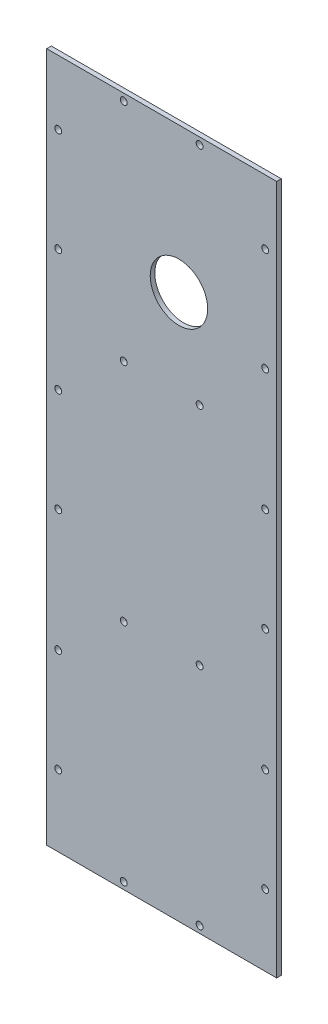
ISO-10303-21;
HEADER;
FILE_DESCRIPTION(('STEP AP214'),'2;1');
FILE_NAME('part.step','',(''),(''),'','','');
FILE_SCHEMA(('AUTOMOTIVE_DESIGN { 1 0 10303 214 1 1 1 1 }'));
ENDSEC;
DATA;
#1=APPLICATION_CONTEXT('core data for automotive mechanical design processes');
#2=APPLICATION_PROTOCOL_DEFINITION('international standard','automotive_design',2000,#1);
#3=PRODUCT_CONTEXT('',#1,'mechanical');
#4=PRODUCT('Part','Part','',(#3));
#5=PRODUCT_RELATED_PRODUCT_CATEGORY('part','',(#4));
#6=PRODUCT_DEFINITION_FORMATION('','',#4);
#7=PRODUCT_DEFINITION_CONTEXT('part definition',#1,'design');
#8=PRODUCT_DEFINITION('design','',#6,#7);
#9=PRODUCT_DEFINITION_SHAPE('','',#8);
#10=(LENGTH_UNIT() NAMED_UNIT(*) SI_UNIT(.MILLI.,.METRE.));
#11=(NAMED_UNIT(*) PLANE_ANGLE_UNIT() SI_UNIT($,.RADIAN.));
#12=(NAMED_UNIT(*) SI_UNIT($,.STERADIAN.) SOLID_ANGLE_UNIT());
#13=UNCERTAINTY_MEASURE_WITH_UNIT(LENGTH_MEASURE(1.E-05),#10,'distance_accuracy_value','');
#14=(GEOMETRIC_REPRESENTATION_CONTEXT(3) GLOBAL_UNCERTAINTY_ASSIGNED_CONTEXT((#13)) GLOBAL_UNIT_ASSIGNED_CONTEXT((#10,
#11,#12)) REPRESENTATION_CONTEXT('',''));
#15=CARTESIAN_POINT('',(0.,0.,0.));
#16=DIRECTION('',(0.,0.,1.));
#17=DIRECTION('',(1.,0.,0.));
#18=AXIS2_PLACEMENT_3D('',#15,#16,#17);
#19=CARTESIAN_POINT('',(-50.,-150.,2.));
#20=DIRECTION('',(1.,0.,0.));
#21=DIRECTION('',(0.,0.,-1.));
#22=AXIS2_PLACEMENT_3D('',#19,#20,#21);
#23=PLANE('',#22);
#24=DIRECTION('',(0.,-1.,0.));
#25=VECTOR('',#24,1.);
#26=CARTESIAN_POINT('',(-50.,-150.,0.));
#27=LINE('',#26,#25);
#28=CARTESIAN_POINT('',(-50.,150.,0.));
#29=VERTEX_POINT('',#28);
#30=CARTESIAN_POINT('',(-50.,-150.,0.));
#31=VERTEX_POINT('',#30);
#32=EDGE_CURVE('E109',#29,#31,#27,.T.);
#33=ORIENTED_EDGE('',*,*,#32,.T.);
#34=DIRECTION('',(0.,0.,-1.));
#35=VECTOR('',#34,1.);
#36=CARTESIAN_POINT('',(-50.,-150.,2.));
#37=LINE('',#36,#35);
#38=CARTESIAN_POINT('',(-50.,-150.,2.));
#39=VERTEX_POINT('',#38);
#40=EDGE_CURVE('E11',#39,#31,#37,.T.);
#41=ORIENTED_EDGE('',*,*,#40,.F.);
#42=DIRECTION('',(0.,-1.,0.));
#43=VECTOR('',#42,1.);
#44=CARTESIAN_POINT('',(-50.,-150.,2.));
#45=LINE('',#44,#43);
#46=CARTESIAN_POINT('',(-50.,150.,2.));
#47=VERTEX_POINT('',#46);
#48=EDGE_CURVE('E92',#47,#39,#45,.T.);
#49=ORIENTED_EDGE('',*,*,#48,.F.);
#50=DIRECTION('',(0.,0.,-1.));
#51=VECTOR('',#50,1.);
#52=CARTESIAN_POINT('',(-50.,150.,2.));
#53=LINE('',#52,#51);
#54=EDGE_CURVE('E105',#47,#29,#53,.T.);
#55=ORIENTED_EDGE('',*,*,#54,.T.);
#56=EDGE_LOOP('',(#33,#41,#49,#55));
#57=FACE_BOUND('',#56,.T.);
#58=ADVANCED_FACE('F38',(#57),#23,.F.);
#59=CARTESIAN_POINT('',(50.,-150.,2.));
#60=DIRECTION('',(0.,1.,0.));
#61=DIRECTION('',(0.,0.,1.));
#62=AXIS2_PLACEMENT_3D('',#59,#60,#61);
#63=PLANE('',#62);
#64=DIRECTION('',(1.,0.,0.));
#65=VECTOR('',#64,1.);
#66=CARTESIAN_POINT('',(50.,-150.,0.));
#67=LINE('',#66,#65);
#68=CARTESIAN_POINT('',(50.,-150.,0.));
#69=VERTEX_POINT('',#68);
#70=EDGE_CURVE('E97',#31,#69,#67,.T.);
#71=ORIENTED_EDGE('',*,*,#70,.T.);
#72=DIRECTION('',(0.,0.,-1.));
#73=VECTOR('',#72,1.);
#74=CARTESIAN_POINT('',(50.,-150.,2.));
#75=LINE('',#74,#73);
#76=CARTESIAN_POINT('',(50.,-150.,2.));
#77=VERTEX_POINT('',#76);
#78=EDGE_CURVE('E48',#77,#69,#75,.T.);
#79=ORIENTED_EDGE('',*,*,#78,.F.);
#80=DIRECTION('',(1.,0.,0.));
#81=VECTOR('',#80,1.);
#82=CARTESIAN_POINT('',(50.,-150.,2.));
#83=LINE('',#82,#81);
#84=EDGE_CURVE('E87',#39,#77,#83,.T.);
#85=ORIENTED_EDGE('',*,*,#84,.F.);
#86=ORIENTED_EDGE('',*,*,#40,.T.);
#87=EDGE_LOOP('',(#71,#79,#85,#86));
#88=FACE_BOUND('',#87,.T.);
#89=ADVANCED_FACE('F96',(#88),#63,.F.);
#90=CARTESIAN_POINT('',(50.,-150.,2.));
#91=DIRECTION('',(-1.,0.,0.));
#92=DIRECTION('',(0.,0.,1.));
#93=AXIS2_PLACEMENT_3D('',#90,#91,#92);
#94=PLANE('',#93);
#95=DIRECTION('',(0.,1.,0.));
#96=VECTOR('',#95,1.);
#97=CARTESIAN_POINT('',(50.,-150.,0.));
#98=LINE('',#97,#96);
#99=CARTESIAN_POINT('',(50.,150.,0.));
#100=VERTEX_POINT('',#99);
#101=EDGE_CURVE('E74',#69,#100,#98,.T.);
#102=ORIENTED_EDGE('',*,*,#101,.T.);
#103=DIRECTION('',(0.,0.,-1.));
#104=VECTOR('',#103,1.);
#105=CARTESIAN_POINT('',(50.,150.,2.));
#106=LINE('',#105,#104);
#107=CARTESIAN_POINT('',(50.,150.,2.));
#108=VERTEX_POINT('',#107);
#109=EDGE_CURVE('E99',#108,#100,#106,.T.);
#110=ORIENTED_EDGE('',*,*,#109,.F.);
#111=DIRECTION('',(0.,1.,0.));
#112=VECTOR('',#111,1.);
#113=CARTESIAN_POINT('',(50.,-150.,2.));
#114=LINE('',#113,#112);
#115=EDGE_CURVE('E90',#77,#108,#114,.T.);
#116=ORIENTED_EDGE('',*,*,#115,.F.);
#117=ORIENTED_EDGE('',*,*,#78,.T.);
#118=EDGE_LOOP('',(#102,#110,#116,#117));
#119=FACE_BOUND('',#118,.T.);
#120=ADVANCED_FACE('F101',(#119),#94,.F.);
#121=CARTESIAN_POINT('',(50.,150.,2.));
#122=DIRECTION('',(0.,-1.,0.));
#123=DIRECTION('',(1.,0.,0.));
#124=AXIS2_PLACEMENT_3D('',#121,#122,#123);
#125=PLANE('',#124);
#126=DIRECTION('',(-1.,0.,0.));
#127=VECTOR('',#126,1.);
#128=CARTESIAN_POINT('',(50.,150.,0.));
#129=LINE('',#128,#127);
#130=EDGE_CURVE('E80',#100,#29,#129,.T.);
#131=ORIENTED_EDGE('',*,*,#130,.T.);
#132=ORIENTED_EDGE('',*,*,#54,.F.);
#133=DIRECTION('',(-1.,0.,0.));
#134=VECTOR('',#133,1.);
#135=CARTESIAN_POINT('',(50.,150.,2.));
#136=LINE('',#135,#134);
#137=EDGE_CURVE('E57',#108,#47,#136,.T.);
#138=ORIENTED_EDGE('',*,*,#137,.F.);
#139=ORIENTED_EDGE('',*,*,#109,.T.);
#140=EDGE_LOOP('',(#131,#132,#138,#139));
#141=FACE_BOUND('',#140,.T.);
#142=ADVANCED_FACE('F241',(#141),#125,.F.);
#143=CARTESIAN_POINT('',(0.,0.,2.));
#144=DIRECTION('',(0.,0.,1.));
#145=DIRECTION('',(1.,0.,0.));
#146=AXIS2_PLACEMENT_3D('',#143,#144,#145);
#147=PLANE('',#146);
#148=CARTESIAN_POINT('',(7.50000000000001,87.,2.));
#149=DIRECTION('',(0.,0.,1.));
#150=DIRECTION('',(1.,0.,0.));
#151=AXIS2_PLACEMENT_3D('',#148,#149,#150);
#152=CIRCLE('',#151,12.5);
#153=CARTESIAN_POINT('',(20.,87.,2.));
#154=VERTEX_POINT('',#153);
#155=EDGE_CURVE('E568',#154,#154,#152,.T.);
#156=ORIENTED_EDGE('',*,*,#155,.F.);
#157=EDGE_LOOP('',(#156));
#158=FACE_BOUND('',#157,.T.);
#159=CARTESIAN_POINT('',(16.5,-147.,2.));
#160=DIRECTION('',(0.,0.,1.));
#161=DIRECTION('',(1.,0.,0.));
#162=AXIS2_PLACEMENT_3D('',#159,#160,#161);
#163=CIRCLE('',#162,1.5);
#164=CARTESIAN_POINT('',(18.,-147.,2.));
#165=VERTEX_POINT('',#164);
#166=EDGE_CURVE('E491',#165,#165,#163,.T.);
#167=ORIENTED_EDGE('',*,*,#166,.F.);
#168=EDGE_LOOP('',(#167));
#169=FACE_BOUND('',#168,.T.);
#170=CARTESIAN_POINT('',(45.000000000002,-119.,2.));
#171=DIRECTION('',(0.,0.,1.));
#172=DIRECTION('',(1.,0.,0.));
#173=AXIS2_PLACEMENT_3D('',#170,#171,#172);
#174=CIRCLE('',#173,1.5);
#175=CARTESIAN_POINT('',(46.500000000002,-119.,2.));
#176=VERTEX_POINT('',#175);
#177=EDGE_CURVE('E495',#176,#176,#174,.T.);
#178=ORIENTED_EDGE('',*,*,#177,.F.);
#179=EDGE_LOOP('',(#178));
#180=FACE_BOUND('',#179,.T.);
#181=CARTESIAN_POINT('',(45.000000000002,-74.,2.));
#182=DIRECTION('',(0.,0.,1.));
#183=DIRECTION('',(1.,0.,0.));
#184=AXIS2_PLACEMENT_3D('',#181,#182,#183);
#185=CIRCLE('',#184,1.5);
#186=CARTESIAN_POINT('',(46.500000000002,-74.,2.));
#187=VERTEX_POINT('',#186);
#188=EDGE_CURVE('E499',#187,#187,#185,.T.);
#189=ORIENTED_EDGE('',*,*,#188,.F.);
#190=EDGE_LOOP('',(#189));
#191=FACE_BOUND('',#190,.T.);
#192=CARTESIAN_POINT('',(-44.999999999998,-119.,2.));
#193=DIRECTION('',(0.,0.,1.));
#194=DIRECTION('',(1.,0.,0.));
#195=AXIS2_PLACEMENT_3D('',#192,#193,#194);
#196=CIRCLE('',#195,1.5);
#197=CARTESIAN_POINT('',(-43.499999999998,-119.,2.));
#198=VERTEX_POINT('',#197);
#199=EDGE_CURVE('E502',#198,#198,#196,.T.);
#200=ORIENTED_EDGE('',*,*,#199,.F.);
#201=EDGE_LOOP('',(#200));
#202=FACE_BOUND('',#201,.T.);
#203=CARTESIAN_POINT('',(16.4999999999993,49.,2.));
#204=DIRECTION('',(0.,0.,1.));
#205=DIRECTION('',(1.,0.,0.));
#206=AXIS2_PLACEMENT_3D('',#203,#204,#205);
#207=CIRCLE('',#206,1.5);
#208=CARTESIAN_POINT('',(17.9999999999993,49.,2.));
#209=VERTEX_POINT('',#208);
#210=EDGE_CURVE('E469',#209,#209,#207,.T.);
#211=ORIENTED_EDGE('',*,*,#210,.F.);
#212=EDGE_LOOP('',(#211));
#213=FACE_BOUND('',#212,.T.);
#214=CARTESIAN_POINT('',(-16.5000000000004,-49.,2.));
#215=DIRECTION('',(0.,0.,1.));
#216=DIRECTION('',(-1.,0.,0.));
#217=AXIS2_PLACEMENT_3D('',#214,#215,#216);
#218=CIRCLE('',#217,1.5);
#219=CARTESIAN_POINT('',(-18.0000000000004,-49.,2.));
#220=VERTEX_POINT('',#219);
#221=EDGE_CURVE('E475',#220,#220,#218,.T.);
#222=ORIENTED_EDGE('',*,*,#221,.F.);
#223=EDGE_LOOP('',(#222));
#224=FACE_BOUND('',#223,.T.);
#225=CARTESIAN_POINT('',(-16.5,-147.,2.));
#226=DIRECTION('',(0.,0.,1.));
#227=DIRECTION('',(-1.,0.,0.));
#228=AXIS2_PLACEMENT_3D('',#225,#226,#227);
#229=CIRCLE('',#228,1.5);
#230=CARTESIAN_POINT('',(-18.,-147.,2.));
#231=VERTEX_POINT('',#230);
#232=EDGE_CURVE('E485',#231,#231,#229,.T.);
#233=ORIENTED_EDGE('',*,*,#232,.F.);
#234=EDGE_LOOP('',(#233));
#235=FACE_BOUND('',#234,.T.);
#236=CARTESIAN_POINT('',(16.4999999999997,-49.,2.));
#237=DIRECTION('',(0.,0.,1.));
#238=DIRECTION('',(1.,0.,0.));
#239=AXIS2_PLACEMENT_3D('',#236,#237,#238);
#240=CIRCLE('',#239,1.5);
#241=CARTESIAN_POINT('',(17.9999999999997,-49.,2.));
#242=VERTEX_POINT('',#241);
#243=EDGE_CURVE('E487',#242,#242,#240,.T.);
#244=ORIENTED_EDGE('',*,*,#243,.F.);
#245=EDGE_LOOP('',(#244));
#246=FACE_BOUND('',#245,.T.);
#247=CARTESIAN_POINT('',(-44.999999999999,24.,2.));
#248=DIRECTION('',(0.,0.,1.));
#249=DIRECTION('',(1.,0.,0.));
#250=AXIS2_PLACEMENT_3D('',#247,#248,#249);
#251=CIRCLE('',#250,1.5);
#252=CARTESIAN_POINT('',(-43.499999999999,24.,2.));
#253=VERTEX_POINT('',#252);
#254=EDGE_CURVE('E522',#253,#253,#251,.T.);
#255=ORIENTED_EDGE('',*,*,#254,.F.);
#256=EDGE_LOOP('',(#255));
#257=FACE_BOUND('',#256,.T.);
#258=CARTESIAN_POINT('',(45.,77.,2.));
#259=DIRECTION('',(0.,0.,1.));
#260=DIRECTION('',(1.,0.,0.));
#261=AXIS2_PLACEMENT_3D('',#258,#259,#260);
#262=CIRCLE('',#261,1.5);
#263=CARTESIAN_POINT('',(46.5,77.,2.));
#264=VERTEX_POINT('',#263);
#265=EDGE_CURVE('E526',#264,#264,#262,.T.);
#266=ORIENTED_EDGE('',*,*,#265,.F.);
#267=EDGE_LOOP('',(#266));
#268=FACE_BOUND('',#267,.T.);
#269=CARTESIAN_POINT('',(45.,122.,2.));
#270=DIRECTION('',(0.,0.,1.));
#271=DIRECTION('',(1.,0.,0.));
#272=AXIS2_PLACEMENT_3D('',#269,#270,#271);
#273=CIRCLE('',#272,1.5);
#274=CARTESIAN_POINT('',(46.5,122.,2.));
#275=VERTEX_POINT('',#274);
#276=EDGE_CURVE('E530',#275,#275,#273,.T.);
#277=ORIENTED_EDGE('',*,*,#276,.F.);
#278=EDGE_LOOP('',(#277));
#279=FACE_BOUND('',#278,.T.);
#280=CARTESIAN_POINT('',(-45.,77.,2.));
#281=DIRECTION('',(0.,0.,1.));
#282=DIRECTION('',(1.,0.,0.));
#283=AXIS2_PLACEMENT_3D('',#280,#281,#282);
#284=CIRCLE('',#283,1.5);
#285=CARTESIAN_POINT('',(-43.5,77.,2.));
#286=VERTEX_POINT('',#285);
#287=EDGE_CURVE('E534',#286,#286,#284,.T.);
#288=ORIENTED_EDGE('',*,*,#287,.F.);
#289=EDGE_LOOP('',(#288));
#290=FACE_BOUND('',#289,.T.);
#291=CARTESIAN_POINT('',(-44.999999999998,-74.,2.));
#292=DIRECTION('',(0.,0.,1.));
#293=DIRECTION('',(1.,0.,0.));
#294=AXIS2_PLACEMENT_3D('',#291,#292,#293);
#295=CIRCLE('',#294,1.5);
#296=CARTESIAN_POINT('',(-43.499999999998,-74.,2.));
#297=VERTEX_POINT('',#296);
#298=EDGE_CURVE('E506',#297,#297,#295,.T.);
#299=ORIENTED_EDGE('',*,*,#298,.F.);
#300=EDGE_LOOP('',(#299));
#301=FACE_BOUND('',#300,.T.);
#302=CARTESIAN_POINT('',(45.000000000001,-21.,2.));
#303=DIRECTION('',(0.,0.,1.));
#304=DIRECTION('',(1.,0.,0.));
#305=AXIS2_PLACEMENT_3D('',#302,#303,#304);
#306=CIRCLE('',#305,1.5);
#307=CARTESIAN_POINT('',(46.500000000001,-21.,2.));
#308=VERTEX_POINT('',#307);
#309=EDGE_CURVE('E510',#308,#308,#306,.T.);
#310=ORIENTED_EDGE('',*,*,#309,.F.);
#311=EDGE_LOOP('',(#310));
#312=FACE_BOUND('',#311,.T.);
#313=CARTESIAN_POINT('',(45.000000000001,24.,2.));
#314=DIRECTION('',(0.,0.,1.));
#315=DIRECTION('',(1.,0.,0.));
#316=AXIS2_PLACEMENT_3D('',#313,#314,#315);
#317=CIRCLE('',#316,1.5);
#318=CARTESIAN_POINT('',(46.500000000001,24.,2.));
#319=VERTEX_POINT('',#318);
#320=EDGE_CURVE('E514',#319,#319,#317,.T.);
#321=ORIENTED_EDGE('',*,*,#320,.F.);
#322=EDGE_LOOP('',(#321));
#323=FACE_BOUND('',#322,.T.);
#324=CARTESIAN_POINT('',(-44.999999999999,-21.,2.));
#325=DIRECTION('',(0.,0.,1.));
#326=DIRECTION('',(1.,0.,0.));
#327=AXIS2_PLACEMENT_3D('',#324,#325,#326);
#328=CIRCLE('',#327,1.5);
#329=CARTESIAN_POINT('',(-43.499999999999,-21.,2.));
#330=VERTEX_POINT('',#329);
#331=EDGE_CURVE('E518',#330,#330,#328,.T.);
#332=ORIENTED_EDGE('',*,*,#331,.F.);
#333=EDGE_LOOP('',(#332));
#334=FACE_BOUND('',#333,.T.);
#335=CARTESIAN_POINT('',(-16.500000000001,147.,2.));
#336=DIRECTION('',(0.,0.,1.));
#337=DIRECTION('',(-1.,0.,0.));
#338=AXIS2_PLACEMENT_3D('',#335,#336,#337);
#339=CIRCLE('',#338,1.5);
#340=CARTESIAN_POINT('',(-18.000000000001,147.,2.));
#341=VERTEX_POINT('',#340);
#342=EDGE_CURVE('E478',#341,#341,#339,.T.);
#343=ORIENTED_EDGE('',*,*,#342,.F.);
#344=EDGE_LOOP('',(#343));
#345=FACE_BOUND('',#344,.T.);
#346=CARTESIAN_POINT('',(16.499999999999,147.,2.));
#347=DIRECTION('',(0.,0.,1.));
#348=DIRECTION('',(1.,0.,0.));
#349=AXIS2_PLACEMENT_3D('',#346,#347,#348);
#350=CIRCLE('',#349,1.5);
#351=CARTESIAN_POINT('',(17.999999999999,147.,2.));
#352=VERTEX_POINT('',#351);
#353=EDGE_CURVE('E470',#352,#352,#350,.T.);
#354=ORIENTED_EDGE('',*,*,#353,.F.);
#355=EDGE_LOOP('',(#354));
#356=FACE_BOUND('',#355,.T.);
#357=CARTESIAN_POINT('',(-16.5000000000007,49.,2.));
#358=DIRECTION('',(0.,0.,1.));
#359=DIRECTION('',(-1.,0.,0.));
#360=AXIS2_PLACEMENT_3D('',#357,#358,#359);
#361=CIRCLE('',#360,1.5);
#362=CARTESIAN_POINT('',(-18.0000000000007,49.,2.));
#363=VERTEX_POINT('',#362);
#364=EDGE_CURVE('E461',#363,#363,#361,.T.);
#365=ORIENTED_EDGE('',*,*,#364,.F.);
#366=EDGE_LOOP('',(#365));
#367=FACE_BOUND('',#366,.T.);
#368=CARTESIAN_POINT('',(-45.,122.,2.));
#369=DIRECTION('',(0.,0.,1.));
#370=DIRECTION('',(1.,0.,0.));
#371=AXIS2_PLACEMENT_3D('',#368,#369,#370);
#372=CIRCLE('',#371,1.5);
#373=CARTESIAN_POINT('',(-43.5,122.,2.));
#374=VERTEX_POINT('',#373);
#375=EDGE_CURVE('E128',#374,#374,#372,.T.);
#376=ORIENTED_EDGE('',*,*,#375,.F.);
#377=EDGE_LOOP('',(#376));
#378=FACE_BOUND('',#377,.T.);
#379=ORIENTED_EDGE('',*,*,#48,.T.);
#380=ORIENTED_EDGE('',*,*,#84,.T.);
#381=ORIENTED_EDGE('',*,*,#115,.T.);
#382=ORIENTED_EDGE('',*,*,#137,.T.);
#383=EDGE_LOOP('',(#379,#380,#381,#382));
#384=FACE_BOUND('',#383,.T.);
#385=ADVANCED_FACE('F88',(#158,#169,#180,#191,#202,#213,#224,#235,#246,#257,#268,#279,#290,#301,
#312,#323,#334,#345,#356,#367,#378,#384),#147,.T.);
#386=CARTESIAN_POINT('',(0.,0.,0.));
#387=DIRECTION('',(0.,0.,1.));
#388=DIRECTION('',(1.,0.,0.));
#389=AXIS2_PLACEMENT_3D('',#386,#387,#388);
#390=PLANE('',#389);
#391=CARTESIAN_POINT('',(7.50000000000001,87.,0.));
#392=DIRECTION('',(0.,0.,-1.));
#393=DIRECTION('',(-1.,0.,0.));
#394=AXIS2_PLACEMENT_3D('',#391,#392,#393);
#395=CIRCLE('',#394,12.5);
#396=CARTESIAN_POINT('',(-4.99999999999999,87.,0.));
#397=VERTEX_POINT('',#396);
#398=EDGE_CURVE('E571',#397,#397,#395,.T.);
#399=ORIENTED_EDGE('',*,*,#398,.F.);
#400=EDGE_LOOP('',(#399));
#401=FACE_BOUND('',#400,.T.);
#402=CARTESIAN_POINT('',(16.5,-147.,0.));
#403=DIRECTION('',(0.,0.,1.));
#404=DIRECTION('',(1.,0.,0.));
#405=AXIS2_PLACEMENT_3D('',#402,#403,#404);
#406=CIRCLE('',#405,1.5);
#407=CARTESIAN_POINT('',(18.,-147.,0.));
#408=VERTEX_POINT('',#407);
#409=EDGE_CURVE('E41',#408,#408,#406,.T.);
#410=ORIENTED_EDGE('',*,*,#409,.T.);
#411=EDGE_LOOP('',(#410));
#412=FACE_BOUND('',#411,.T.);
#413=CARTESIAN_POINT('',(45.000000000002,-119.,0.));
#414=DIRECTION('',(0.,0.,1.));
#415=DIRECTION('',(1.,0.,0.));
#416=AXIS2_PLACEMENT_3D('',#413,#414,#415);
#417=CIRCLE('',#416,1.5);
#418=CARTESIAN_POINT('',(46.500000000002,-119.,0.));
#419=VERTEX_POINT('',#418);
#420=EDGE_CURVE('E195',#419,#419,#417,.T.);
#421=ORIENTED_EDGE('',*,*,#420,.T.);
#422=EDGE_LOOP('',(#421));
#423=FACE_BOUND('',#422,.T.);
#424=CARTESIAN_POINT('',(45.000000000002,-74.,0.));
#425=DIRECTION('',(0.,0.,1.));
#426=DIRECTION('',(1.,0.,0.));
#427=AXIS2_PLACEMENT_3D('',#424,#425,#426);
#428=CIRCLE('',#427,1.5);
#429=CARTESIAN_POINT('',(46.500000000002,-74.,0.));
#430=VERTEX_POINT('',#429);
#431=EDGE_CURVE('E192',#430,#430,#428,.T.);
#432=ORIENTED_EDGE('',*,*,#431,.T.);
#433=EDGE_LOOP('',(#432));
#434=FACE_BOUND('',#433,.T.);
#435=CARTESIAN_POINT('',(-44.999999999998,-119.,0.));
#436=DIRECTION('',(0.,0.,1.));
#437=DIRECTION('',(1.,0.,0.));
#438=AXIS2_PLACEMENT_3D('',#435,#436,#437);
#439=CIRCLE('',#438,1.5);
#440=CARTESIAN_POINT('',(-43.499999999998,-119.,0.));
#441=VERTEX_POINT('',#440);
#442=EDGE_CURVE('E188',#441,#441,#439,.T.);
#443=ORIENTED_EDGE('',*,*,#442,.T.);
#444=EDGE_LOOP('',(#443));
#445=FACE_BOUND('',#444,.T.);
#446=CARTESIAN_POINT('',(16.4999999999993,49.,0.));
#447=DIRECTION('',(0.,0.,1.));
#448=DIRECTION('',(1.,0.,0.));
#449=AXIS2_PLACEMENT_3D('',#446,#447,#448);
#450=CIRCLE('',#449,1.5);
#451=CARTESIAN_POINT('',(17.9999999999993,49.,0.));
#452=VERTEX_POINT('',#451);
#453=EDGE_CURVE('E184',#452,#452,#450,.T.);
#454=ORIENTED_EDGE('',*,*,#453,.T.);
#455=EDGE_LOOP('',(#454));
#456=FACE_BOUND('',#455,.T.);
#457=CARTESIAN_POINT('',(-16.5000000000004,-49.,0.));
#458=DIRECTION('',(0.,0.,1.));
#459=DIRECTION('',(1.,0.,0.));
#460=AXIS2_PLACEMENT_3D('',#457,#458,#459);
#461=CIRCLE('',#460,1.5);
#462=CARTESIAN_POINT('',(-15.0000000000003,-49.,0.));
#463=VERTEX_POINT('',#462);
#464=EDGE_CURVE('E180',#463,#463,#461,.T.);
#465=ORIENTED_EDGE('',*,*,#464,.T.);
#466=EDGE_LOOP('',(#465));
#467=FACE_BOUND('',#466,.T.);
#468=CARTESIAN_POINT('',(-16.5,-147.,0.));
#469=DIRECTION('',(0.,0.,1.));
#470=DIRECTION('',(1.,0.,0.));
#471=AXIS2_PLACEMENT_3D('',#468,#469,#470);
#472=CIRCLE('',#471,1.5);
#473=CARTESIAN_POINT('',(-15.,-147.,0.));
#474=VERTEX_POINT('',#473);
#475=EDGE_CURVE('E176',#474,#474,#472,.T.);
#476=ORIENTED_EDGE('',*,*,#475,.T.);
#477=EDGE_LOOP('',(#476));
#478=FACE_BOUND('',#477,.T.);
#479=CARTESIAN_POINT('',(16.4999999999997,-49.,0.));
#480=DIRECTION('',(0.,0.,1.));
#481=DIRECTION('',(1.,0.,0.));
#482=AXIS2_PLACEMENT_3D('',#479,#480,#481);
#483=CIRCLE('',#482,1.5);
#484=CARTESIAN_POINT('',(17.9999999999997,-49.,0.));
#485=VERTEX_POINT('',#484);
#486=EDGE_CURVE('E172',#485,#485,#483,.T.);
#487=ORIENTED_EDGE('',*,*,#486,.T.);
#488=EDGE_LOOP('',(#487));
#489=FACE_BOUND('',#488,.T.);
#490=CARTESIAN_POINT('',(-44.999999999999,24.,0.));
#491=DIRECTION('',(0.,0.,1.));
#492=DIRECTION('',(1.,0.,0.));
#493=AXIS2_PLACEMENT_3D('',#490,#491,#492);
#494=CIRCLE('',#493,1.5);
#495=CARTESIAN_POINT('',(-43.499999999999,24.,0.));
#496=VERTEX_POINT('',#495);
#497=EDGE_CURVE('E168',#496,#496,#494,.T.);
#498=ORIENTED_EDGE('',*,*,#497,.T.);
#499=EDGE_LOOP('',(#498));
#500=FACE_BOUND('',#499,.T.);
#501=CARTESIAN_POINT('',(45.,77.,0.));
#502=DIRECTION('',(0.,0.,1.));
#503=DIRECTION('',(1.,0.,0.));
#504=AXIS2_PLACEMENT_3D('',#501,#502,#503);
#505=CIRCLE('',#504,1.5);
#506=CARTESIAN_POINT('',(46.5,77.,0.));
#507=VERTEX_POINT('',#506);
#508=EDGE_CURVE('E164',#507,#507,#505,.T.);
#509=ORIENTED_EDGE('',*,*,#508,.T.);
#510=EDGE_LOOP('',(#509));
#511=FACE_BOUND('',#510,.T.);
#512=CARTESIAN_POINT('',(45.,122.,0.));
#513=DIRECTION('',(0.,0.,1.));
#514=DIRECTION('',(1.,0.,0.));
#515=AXIS2_PLACEMENT_3D('',#512,#513,#514);
#516=CIRCLE('',#515,1.5);
#517=CARTESIAN_POINT('',(46.5,122.,0.));
#518=VERTEX_POINT('',#517);
#519=EDGE_CURVE('E160',#518,#518,#516,.T.);
#520=ORIENTED_EDGE('',*,*,#519,.T.);
#521=EDGE_LOOP('',(#520));
#522=FACE_BOUND('',#521,.T.);
#523=CARTESIAN_POINT('',(-45.,77.,0.));
#524=DIRECTION('',(0.,0.,1.));
#525=DIRECTION('',(1.,0.,0.));
#526=AXIS2_PLACEMENT_3D('',#523,#524,#525);
#527=CIRCLE('',#526,1.5);
#528=CARTESIAN_POINT('',(-43.5,77.,0.));
#529=VERTEX_POINT('',#528);
#530=EDGE_CURVE('E156',#529,#529,#527,.T.);
#531=ORIENTED_EDGE('',*,*,#530,.T.);
#532=EDGE_LOOP('',(#531));
#533=FACE_BOUND('',#532,.T.);
#534=CARTESIAN_POINT('',(-44.999999999998,-74.,0.));
#535=DIRECTION('',(0.,0.,1.));
#536=DIRECTION('',(1.,0.,0.));
#537=AXIS2_PLACEMENT_3D('',#534,#535,#536);
#538=CIRCLE('',#537,1.5);
#539=CARTESIAN_POINT('',(-43.499999999998,-74.,0.));
#540=VERTEX_POINT('',#539);
#541=EDGE_CURVE('E152',#540,#540,#538,.T.);
#542=ORIENTED_EDGE('',*,*,#541,.T.);
#543=EDGE_LOOP('',(#542));
#544=FACE_BOUND('',#543,.T.);
#545=CARTESIAN_POINT('',(45.000000000001,-21.,0.));
#546=DIRECTION('',(0.,0.,1.));
#547=DIRECTION('',(1.,0.,0.));
#548=AXIS2_PLACEMENT_3D('',#545,#546,#547);
#549=CIRCLE('',#548,1.5);
#550=CARTESIAN_POINT('',(46.500000000001,-21.,0.));
#551=VERTEX_POINT('',#550);
#552=EDGE_CURVE('E148',#551,#551,#549,.T.);
#553=ORIENTED_EDGE('',*,*,#552,.T.);
#554=EDGE_LOOP('',(#553));
#555=FACE_BOUND('',#554,.T.);
#556=CARTESIAN_POINT('',(45.000000000001,24.,0.));
#557=DIRECTION('',(0.,0.,1.));
#558=DIRECTION('',(1.,0.,0.));
#559=AXIS2_PLACEMENT_3D('',#556,#557,#558);
#560=CIRCLE('',#559,1.5);
#561=CARTESIAN_POINT('',(46.500000000001,24.,0.));
#562=VERTEX_POINT('',#561);
#563=EDGE_CURVE('E144',#562,#562,#560,.T.);
#564=ORIENTED_EDGE('',*,*,#563,.T.);
#565=EDGE_LOOP('',(#564));
#566=FACE_BOUND('',#565,.T.);
#567=CARTESIAN_POINT('',(-44.999999999999,-21.,0.));
#568=DIRECTION('',(0.,0.,1.));
#569=DIRECTION('',(1.,0.,0.));
#570=AXIS2_PLACEMENT_3D('',#567,#568,#569);
#571=CIRCLE('',#570,1.5);
#572=CARTESIAN_POINT('',(-43.499999999999,-21.,0.));
#573=VERTEX_POINT('',#572);
#574=EDGE_CURVE('E140',#573,#573,#571,.T.);
#575=ORIENTED_EDGE('',*,*,#574,.T.);
#576=EDGE_LOOP('',(#575));
#577=FACE_BOUND('',#576,.T.);
#578=CARTESIAN_POINT('',(-16.500000000001,147.,0.));
#579=DIRECTION('',(0.,0.,1.));
#580=DIRECTION('',(1.,0.,0.));
#581=AXIS2_PLACEMENT_3D('',#578,#579,#580);
#582=CIRCLE('',#581,1.5);
#583=CARTESIAN_POINT('',(-15.000000000001,147.,0.));
#584=VERTEX_POINT('',#583);
#585=EDGE_CURVE('E136',#584,#584,#582,.T.);
#586=ORIENTED_EDGE('',*,*,#585,.T.);
#587=EDGE_LOOP('',(#586));
#588=FACE_BOUND('',#587,.T.);
#589=CARTESIAN_POINT('',(16.499999999999,147.,0.));
#590=DIRECTION('',(0.,0.,1.));
#591=DIRECTION('',(1.,0.,0.));
#592=AXIS2_PLACEMENT_3D('',#589,#590,#591);
#593=CIRCLE('',#592,1.5);
#594=CARTESIAN_POINT('',(17.999999999999,147.,0.));
#595=VERTEX_POINT('',#594);
#596=EDGE_CURVE('E132',#595,#595,#593,.T.);
#597=ORIENTED_EDGE('',*,*,#596,.T.);
#598=EDGE_LOOP('',(#597));
#599=FACE_BOUND('',#598,.T.);
#600=CARTESIAN_POINT('',(-16.5000000000007,49.,0.));
#601=DIRECTION('',(0.,0.,1.));
#602=DIRECTION('',(1.,0.,0.));
#603=AXIS2_PLACEMENT_3D('',#600,#601,#602);
#604=CIRCLE('',#603,1.5);
#605=CARTESIAN_POINT('',(-15.0000000000007,49.,0.));
#606=VERTEX_POINT('',#605);
#607=EDGE_CURVE('E127',#606,#606,#604,.T.);
#608=ORIENTED_EDGE('',*,*,#607,.T.);
#609=EDGE_LOOP('',(#608));
#610=FACE_BOUND('',#609,.T.);
#611=CARTESIAN_POINT('',(-45.,122.,0.));
#612=DIRECTION('',(0.,0.,1.));
#613=DIRECTION('',(1.,0.,0.));
#614=AXIS2_PLACEMENT_3D('',#611,#612,#613);
#615=CIRCLE('',#614,1.5);
#616=CARTESIAN_POINT('',(-43.5,122.,0.));
#617=VERTEX_POINT('',#616);
#618=EDGE_CURVE('E123',#617,#617,#615,.T.);
#619=ORIENTED_EDGE('',*,*,#618,.T.);
#620=EDGE_LOOP('',(#619));
#621=FACE_BOUND('',#620,.T.);
#622=ORIENTED_EDGE('',*,*,#32,.F.);
#623=ORIENTED_EDGE('',*,*,#130,.F.);
#624=ORIENTED_EDGE('',*,*,#101,.F.);
#625=ORIENTED_EDGE('',*,*,#70,.F.);
#626=EDGE_LOOP('',(#622,#623,#624,#625));
#627=FACE_BOUND('',#626,.T.);
#628=ADVANCED_FACE('F204',(#401,#412,#423,#434,#445,#456,#467,#478,#489,#500,#511,#522,#533,
#544,#555,#566,#577,#588,#599,#610,#621,#627),#390,.F.);
#629=CARTESIAN_POINT('',(-45.,122.,-8.));
#630=DIRECTION('',(0.,0.,1.));
#631=DIRECTION('',(1.,0.,0.));
#632=AXIS2_PLACEMENT_3D('',#629,#630,#631);
#633=CYLINDRICAL_SURFACE('',#632,1.5);
#634=ORIENTED_EDGE('',*,*,#375,.T.);
#635=EDGE_LOOP('',(#634));
#636=FACE_BOUND('',#635,.T.);
#637=ORIENTED_EDGE('',*,*,#618,.F.);
#638=EDGE_LOOP('',(#637));
#639=FACE_BOUND('',#638,.T.);
#640=ADVANCED_FACE('F231',(#636,#639),#633,.F.);
#641=CARTESIAN_POINT('',(-16.5000000000007,49.,-8.));
#642=DIRECTION('',(0.,0.,1.));
#643=DIRECTION('',(1.,0.,0.));
#644=AXIS2_PLACEMENT_3D('',#641,#642,#643);
#645=CYLINDRICAL_SURFACE('',#644,1.5);
#646=ORIENTED_EDGE('',*,*,#364,.T.);
#647=EDGE_LOOP('',(#646));
#648=FACE_BOUND('',#647,.T.);
#649=ORIENTED_EDGE('',*,*,#607,.F.);
#650=EDGE_LOOP('',(#649));
#651=FACE_BOUND('',#650,.T.);
#652=ADVANCED_FACE('F238',(#648,#651),#645,.F.);
#653=CARTESIAN_POINT('',(16.499999999999,147.,-8.));
#654=DIRECTION('',(0.,0.,1.));
#655=DIRECTION('',(1.,0.,0.));
#656=AXIS2_PLACEMENT_3D('',#653,#654,#655);
#657=CYLINDRICAL_SURFACE('',#656,1.5);
#658=ORIENTED_EDGE('',*,*,#353,.T.);
#659=EDGE_LOOP('',(#658));
#660=FACE_BOUND('',#659,.T.);
#661=ORIENTED_EDGE('',*,*,#596,.F.);
#662=EDGE_LOOP('',(#661));
#663=FACE_BOUND('',#662,.T.);
#664=ADVANCED_FACE('F417',(#660,#663),#657,.F.);
#665=CARTESIAN_POINT('',(-16.500000000001,147.,-8.));
#666=DIRECTION('',(0.,0.,1.));
#667=DIRECTION('',(1.,0.,0.));
#668=AXIS2_PLACEMENT_3D('',#665,#666,#667);
#669=CYLINDRICAL_SURFACE('',#668,1.5);
#670=ORIENTED_EDGE('',*,*,#342,.T.);
#671=EDGE_LOOP('',(#670));
#672=FACE_BOUND('',#671,.T.);
#673=ORIENTED_EDGE('',*,*,#585,.F.);
#674=EDGE_LOOP('',(#673));
#675=FACE_BOUND('',#674,.T.);
#676=ADVANCED_FACE('F408',(#672,#675),#669,.F.);
#677=CARTESIAN_POINT('',(-44.999999999999,-21.,-8.));
#678=DIRECTION('',(0.,0.,1.));
#679=DIRECTION('',(1.,0.,0.));
#680=AXIS2_PLACEMENT_3D('',#677,#678,#679);
#681=CYLINDRICAL_SURFACE('',#680,1.5);
#682=ORIENTED_EDGE('',*,*,#331,.T.);
#683=EDGE_LOOP('',(#682));
#684=FACE_BOUND('',#683,.T.);
#685=ORIENTED_EDGE('',*,*,#574,.F.);
#686=EDGE_LOOP('',(#685));
#687=FACE_BOUND('',#686,.T.);
#688=ADVANCED_FACE('F399',(#684,#687),#681,.F.);
#689=CARTESIAN_POINT('',(45.000000000001,24.,-8.));
#690=DIRECTION('',(0.,0.,1.));
#691=DIRECTION('',(1.,0.,0.));
#692=AXIS2_PLACEMENT_3D('',#689,#690,#691);
#693=CYLINDRICAL_SURFACE('',#692,1.5);
#694=ORIENTED_EDGE('',*,*,#320,.T.);
#695=EDGE_LOOP('',(#694));
#696=FACE_BOUND('',#695,.T.);
#697=ORIENTED_EDGE('',*,*,#563,.F.);
#698=EDGE_LOOP('',(#697));
#699=FACE_BOUND('',#698,.T.);
#700=ADVANCED_FACE('F390',(#696,#699),#693,.F.);
#701=CARTESIAN_POINT('',(45.000000000001,-21.,-8.));
#702=DIRECTION('',(0.,0.,1.));
#703=DIRECTION('',(1.,0.,0.));
#704=AXIS2_PLACEMENT_3D('',#701,#702,#703);
#705=CYLINDRICAL_SURFACE('',#704,1.5);
#706=ORIENTED_EDGE('',*,*,#309,.T.);
#707=EDGE_LOOP('',(#706));
#708=FACE_BOUND('',#707,.T.);
#709=ORIENTED_EDGE('',*,*,#552,.F.);
#710=EDGE_LOOP('',(#709));
#711=FACE_BOUND('',#710,.T.);
#712=ADVANCED_FACE('F381',(#708,#711),#705,.F.);
#713=CARTESIAN_POINT('',(-44.999999999998,-74.,-8.));
#714=DIRECTION('',(0.,0.,1.));
#715=DIRECTION('',(1.,0.,0.));
#716=AXIS2_PLACEMENT_3D('',#713,#714,#715);
#717=CYLINDRICAL_SURFACE('',#716,1.5);
#718=ORIENTED_EDGE('',*,*,#298,.T.);
#719=EDGE_LOOP('',(#718));
#720=FACE_BOUND('',#719,.T.);
#721=ORIENTED_EDGE('',*,*,#541,.F.);
#722=EDGE_LOOP('',(#721));
#723=FACE_BOUND('',#722,.T.);
#724=ADVANCED_FACE('F372',(#720,#723),#717,.F.);
#725=CARTESIAN_POINT('',(-45.,77.,-8.));
#726=DIRECTION('',(0.,0.,1.));
#727=DIRECTION('',(1.,0.,0.));
#728=AXIS2_PLACEMENT_3D('',#725,#726,#727);
#729=CYLINDRICAL_SURFACE('',#728,1.5);
#730=ORIENTED_EDGE('',*,*,#287,.T.);
#731=EDGE_LOOP('',(#730));
#732=FACE_BOUND('',#731,.T.);
#733=ORIENTED_EDGE('',*,*,#530,.F.);
#734=EDGE_LOOP('',(#733));
#735=FACE_BOUND('',#734,.T.);
#736=ADVANCED_FACE('F363',(#732,#735),#729,.F.);
#737=CARTESIAN_POINT('',(45.,122.,-8.));
#738=DIRECTION('',(0.,0.,1.));
#739=DIRECTION('',(1.,0.,0.));
#740=AXIS2_PLACEMENT_3D('',#737,#738,#739);
#741=CYLINDRICAL_SURFACE('',#740,1.5);
#742=ORIENTED_EDGE('',*,*,#276,.T.);
#743=EDGE_LOOP('',(#742));
#744=FACE_BOUND('',#743,.T.);
#745=ORIENTED_EDGE('',*,*,#519,.F.);
#746=EDGE_LOOP('',(#745));
#747=FACE_BOUND('',#746,.T.);
#748=ADVANCED_FACE('F354',(#744,#747),#741,.F.);
#749=CARTESIAN_POINT('',(45.,77.,-8.));
#750=DIRECTION('',(0.,0.,1.));
#751=DIRECTION('',(1.,0.,0.));
#752=AXIS2_PLACEMENT_3D('',#749,#750,#751);
#753=CYLINDRICAL_SURFACE('',#752,1.5);
#754=ORIENTED_EDGE('',*,*,#265,.T.);
#755=EDGE_LOOP('',(#754));
#756=FACE_BOUND('',#755,.T.);
#757=ORIENTED_EDGE('',*,*,#508,.F.);
#758=EDGE_LOOP('',(#757));
#759=FACE_BOUND('',#758,.T.);
#760=ADVANCED_FACE('F345',(#756,#759),#753,.F.);
#761=CARTESIAN_POINT('',(-44.999999999999,24.,-8.));
#762=DIRECTION('',(0.,0.,1.));
#763=DIRECTION('',(1.,0.,0.));
#764=AXIS2_PLACEMENT_3D('',#761,#762,#763);
#765=CYLINDRICAL_SURFACE('',#764,1.5);
#766=ORIENTED_EDGE('',*,*,#254,.T.);
#767=EDGE_LOOP('',(#766));
#768=FACE_BOUND('',#767,.T.);
#769=ORIENTED_EDGE('',*,*,#497,.F.);
#770=EDGE_LOOP('',(#769));
#771=FACE_BOUND('',#770,.T.);
#772=ADVANCED_FACE('F336',(#768,#771),#765,.F.);
#773=CARTESIAN_POINT('',(16.4999999999997,-49.,-8.));
#774=DIRECTION('',(0.,0.,1.));
#775=DIRECTION('',(1.,0.,0.));
#776=AXIS2_PLACEMENT_3D('',#773,#774,#775);
#777=CYLINDRICAL_SURFACE('',#776,1.5);
#778=ORIENTED_EDGE('',*,*,#243,.T.);
#779=EDGE_LOOP('',(#778));
#780=FACE_BOUND('',#779,.T.);
#781=ORIENTED_EDGE('',*,*,#486,.F.);
#782=EDGE_LOOP('',(#781));
#783=FACE_BOUND('',#782,.T.);
#784=ADVANCED_FACE('F327',(#780,#783),#777,.F.);
#785=CARTESIAN_POINT('',(-16.5,-147.,-8.));
#786=DIRECTION('',(0.,0.,1.));
#787=DIRECTION('',(1.,0.,0.));
#788=AXIS2_PLACEMENT_3D('',#785,#786,#787);
#789=CYLINDRICAL_SURFACE('',#788,1.5);
#790=ORIENTED_EDGE('',*,*,#232,.T.);
#791=EDGE_LOOP('',(#790));
#792=FACE_BOUND('',#791,.T.);
#793=ORIENTED_EDGE('',*,*,#475,.F.);
#794=EDGE_LOOP('',(#793));
#795=FACE_BOUND('',#794,.T.);
#796=ADVANCED_FACE('F318',(#792,#795),#789,.F.);
#797=CARTESIAN_POINT('',(-16.5000000000004,-49.,-8.));
#798=DIRECTION('',(0.,0.,1.));
#799=DIRECTION('',(1.,0.,0.));
#800=AXIS2_PLACEMENT_3D('',#797,#798,#799);
#801=CYLINDRICAL_SURFACE('',#800,1.5);
#802=ORIENTED_EDGE('',*,*,#221,.T.);
#803=EDGE_LOOP('',(#802));
#804=FACE_BOUND('',#803,.T.);
#805=ORIENTED_EDGE('',*,*,#464,.F.);
#806=EDGE_LOOP('',(#805));
#807=FACE_BOUND('',#806,.T.);
#808=ADVANCED_FACE('F309',(#804,#807),#801,.F.);
#809=CARTESIAN_POINT('',(16.4999999999993,49.,-8.));
#810=DIRECTION('',(0.,0.,1.));
#811=DIRECTION('',(1.,0.,0.));
#812=AXIS2_PLACEMENT_3D('',#809,#810,#811);
#813=CYLINDRICAL_SURFACE('',#812,1.5);
#814=ORIENTED_EDGE('',*,*,#210,.T.);
#815=EDGE_LOOP('',(#814));
#816=FACE_BOUND('',#815,.T.);
#817=ORIENTED_EDGE('',*,*,#453,.F.);
#818=EDGE_LOOP('',(#817));
#819=FACE_BOUND('',#818,.T.);
#820=ADVANCED_FACE('F301',(#816,#819),#813,.F.);
#821=CARTESIAN_POINT('',(-44.999999999998,-119.,-8.));
#822=DIRECTION('',(0.,0.,1.));
#823=DIRECTION('',(1.,0.,0.));
#824=AXIS2_PLACEMENT_3D('',#821,#822,#823);
#825=CYLINDRICAL_SURFACE('',#824,1.5);
#826=ORIENTED_EDGE('',*,*,#199,.T.);
#827=EDGE_LOOP('',(#826));
#828=FACE_BOUND('',#827,.T.);
#829=ORIENTED_EDGE('',*,*,#442,.F.);
#830=EDGE_LOOP('',(#829));
#831=FACE_BOUND('',#830,.T.);
#832=ADVANCED_FACE('F292',(#828,#831),#825,.F.);
#833=CARTESIAN_POINT('',(45.000000000002,-74.,-8.));
#834=DIRECTION('',(0.,0.,1.));
#835=DIRECTION('',(1.,0.,0.));
#836=AXIS2_PLACEMENT_3D('',#833,#834,#835);
#837=CYLINDRICAL_SURFACE('',#836,1.5);
#838=ORIENTED_EDGE('',*,*,#188,.T.);
#839=EDGE_LOOP('',(#838));
#840=FACE_BOUND('',#839,.T.);
#841=ORIENTED_EDGE('',*,*,#431,.F.);
#842=EDGE_LOOP('',(#841));
#843=FACE_BOUND('',#842,.T.);
#844=ADVANCED_FACE('F218',(#840,#843),#837,.F.);
#845=CARTESIAN_POINT('',(45.000000000002,-119.,-8.));
#846=DIRECTION('',(0.,0.,1.));
#847=DIRECTION('',(1.,0.,0.));
#848=AXIS2_PLACEMENT_3D('',#845,#846,#847);
#849=CYLINDRICAL_SURFACE('',#848,1.5);
#850=ORIENTED_EDGE('',*,*,#177,.T.);
#851=EDGE_LOOP('',(#850));
#852=FACE_BOUND('',#851,.T.);
#853=ORIENTED_EDGE('',*,*,#420,.F.);
#854=EDGE_LOOP('',(#853));
#855=FACE_BOUND('',#854,.T.);
#856=ADVANCED_FACE('F209',(#852,#855),#849,.F.);
#857=CARTESIAN_POINT('',(16.5,-147.,-8.));
#858=DIRECTION('',(0.,0.,1.));
#859=DIRECTION('',(1.,0.,0.));
#860=AXIS2_PLACEMENT_3D('',#857,#858,#859);
#861=CYLINDRICAL_SURFACE('',#860,1.5);
#862=ORIENTED_EDGE('',*,*,#166,.T.);
#863=EDGE_LOOP('',(#862));
#864=FACE_BOUND('',#863,.T.);
#865=ORIENTED_EDGE('',*,*,#409,.F.);
#866=EDGE_LOOP('',(#865));
#867=FACE_BOUND('',#866,.T.);
#868=ADVANCED_FACE('F206',(#864,#867),#861,.F.);
#869=CARTESIAN_POINT('',(7.50000000000001,87.,10.));
#870=DIRECTION('',(0.,0.,-1.));
#871=DIRECTION('',(-1.,0.,0.));
#872=AXIS2_PLACEMENT_3D('',#869,#870,#871);
#873=CYLINDRICAL_SURFACE('',#872,12.5);
#874=ORIENTED_EDGE('',*,*,#155,.T.);
#875=EDGE_LOOP('',(#874));
#876=FACE_BOUND('',#875,.T.);
#877=ORIENTED_EDGE('',*,*,#398,.T.);
#878=EDGE_LOOP('',(#877));
#879=FACE_BOUND('',#878,.T.);
#880=ADVANCED_FACE('F208',(#876,#879),#873,.F.);
#881=CLOSED_SHELL('',(#58,#89,#120,#142,#385,#628,#640,#652,#664,#676,#688,#700,#712,#724,#736,
#748,#760,#772,#784,#796,#808,#820,#832,#844,#856,#868,#880));
#882=MANIFOLD_SOLID_BREP('B2',#881);
#883=ADVANCED_BREP_SHAPE_REPRESENTATION('',(#18,#882),#14);
#884=SHAPE_DEFINITION_REPRESENTATION(#9,#883);
ENDSEC;
END-ISO-10303-21;
